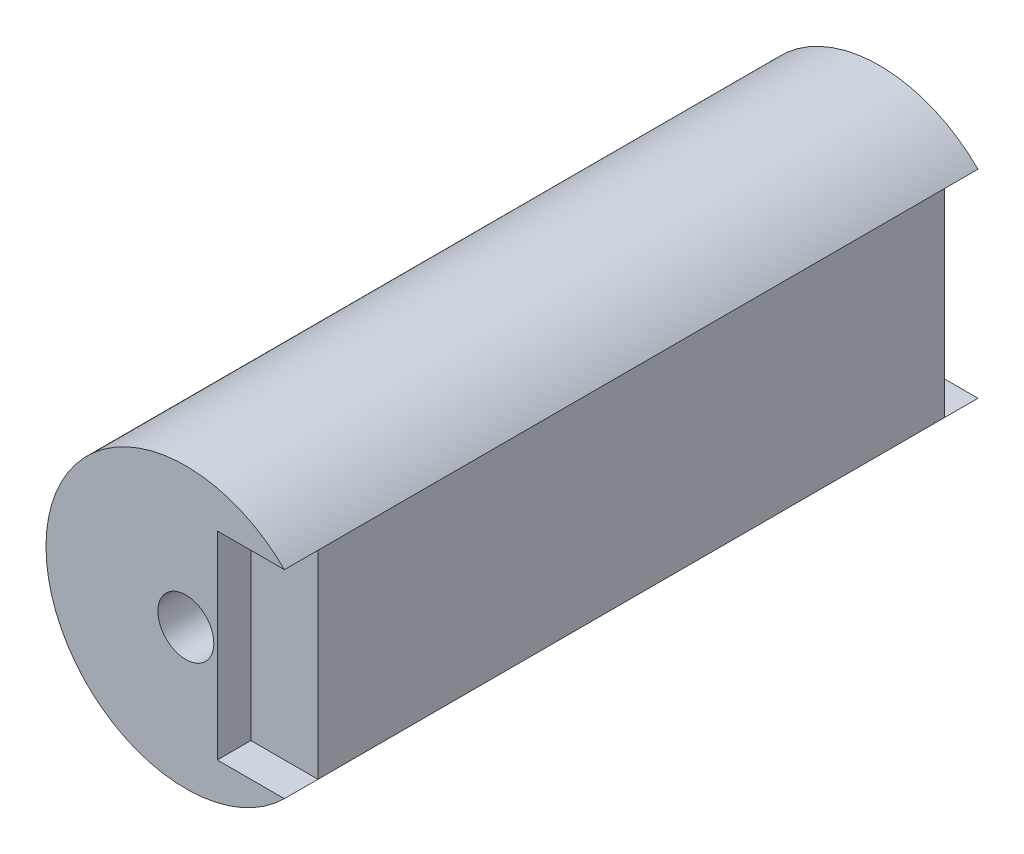
ISO-10303-21;
HEADER;
FILE_DESCRIPTION(('STEP AP214'),'2;1');
FILE_NAME('part.step','',(''),(''),'','','');
FILE_SCHEMA(('AUTOMOTIVE_DESIGN { 1 0 10303 214 1 1 1 1 }'));
ENDSEC;
DATA;
#1=APPLICATION_CONTEXT('core data for automotive mechanical design processes');
#2=APPLICATION_PROTOCOL_DEFINITION('international standard','automotive_design',2000,#1);
#3=PRODUCT_CONTEXT('',#1,'mechanical');
#4=PRODUCT('Part','Part','',(#3));
#5=PRODUCT_RELATED_PRODUCT_CATEGORY('part','',(#4));
#6=PRODUCT_DEFINITION_FORMATION('','',#4);
#7=PRODUCT_DEFINITION_CONTEXT('part definition',#1,'design');
#8=PRODUCT_DEFINITION('design','',#6,#7);
#9=PRODUCT_DEFINITION_SHAPE('','',#8);
#10=(LENGTH_UNIT() NAMED_UNIT(*) SI_UNIT(.MILLI.,.METRE.));
#11=(NAMED_UNIT(*) PLANE_ANGLE_UNIT() SI_UNIT($,.RADIAN.));
#12=(NAMED_UNIT(*) SI_UNIT($,.STERADIAN.) SOLID_ANGLE_UNIT());
#13=UNCERTAINTY_MEASURE_WITH_UNIT(LENGTH_MEASURE(1.E-05),#10,'distance_accuracy_value','');
#14=(GEOMETRIC_REPRESENTATION_CONTEXT(3) GLOBAL_UNCERTAINTY_ASSIGNED_CONTEXT((#13)) GLOBAL_UNIT_ASSIGNED_CONTEXT((#10,
#11,#12)) REPRESENTATION_CONTEXT('',''));
#15=CARTESIAN_POINT('',(0.,0.,0.));
#16=DIRECTION('',(0.,0.,1.));
#17=DIRECTION('',(1.,0.,0.));
#18=AXIS2_PLACEMENT_3D('',#15,#16,#17);
#19=CARTESIAN_POINT('',(8.81236982140303,8.86522070401099,0.));
#20=DIRECTION('',(-1.,0.,0.));
#21=DIRECTION('',(0.,0.,1.));
#22=AXIS2_PLACEMENT_3D('',#19,#20,#21);
#23=PLANE('',#22);
#24=DIRECTION('',(0.,0.,1.));
#25=VECTOR('',#24,1.);
#26=CARTESIAN_POINT('',(8.81236982140303,-8.86522070401099,11.2));
#27=LINE('',#26,#25);
#28=CARTESIAN_POINT('',(8.81236982140303,-8.86522070401099,70.2));
#29=VERTEX_POINT('',#28);
#30=CARTESIAN_POINT('',(8.81236982140303,-8.86522070401099,14.2));
#31=VERTEX_POINT('',#30);
#32=EDGE_CURVE('E150',#29,#31,#27,.F.);
#33=ORIENTED_EDGE('',*,*,#32,.T.);
#34=DIRECTION('',(0.,-1.,0.));
#35=VECTOR('',#34,1.);
#36=CARTESIAN_POINT('',(8.81236982140303,0.,14.2));
#37=LINE('',#36,#35);
#38=CARTESIAN_POINT('',(8.81236982140303,8.86522070401099,14.2));
#39=VERTEX_POINT('',#38);
#40=EDGE_CURVE('E180',#39,#31,#37,.T.);
#41=ORIENTED_EDGE('',*,*,#40,.F.);
#42=DIRECTION('',(0.,0.,1.));
#43=VECTOR('',#42,1.);
#44=CARTESIAN_POINT('',(8.81236982140303,8.86522070401099,11.2));
#45=LINE('',#44,#43);
#46=CARTESIAN_POINT('',(8.81236982140303,8.86522070401099,70.2));
#47=VERTEX_POINT('',#46);
#48=EDGE_CURVE('E63',#39,#47,#45,.T.);
#49=ORIENTED_EDGE('',*,*,#48,.T.);
#50=DIRECTION('',(0.,-1.,0.));
#51=VECTOR('',#50,1.);
#52=CARTESIAN_POINT('',(8.81236982140303,0.,70.2));
#53=LINE('',#52,#51);
#54=EDGE_CURVE('E144',#47,#29,#53,.T.);
#55=ORIENTED_EDGE('',*,*,#54,.T.);
#56=EDGE_LOOP('',(#33,#41,#49,#55));
#57=FACE_BOUND('',#56,.T.);
#58=ADVANCED_FACE('F40',(#57),#23,.F.);
#59=CARTESIAN_POINT('',(0.,0.,11.2));
#60=DIRECTION('',(0.,0.,1.));
#61=DIRECTION('',(1.,0.,0.));
#62=AXIS2_PLACEMENT_3D('',#59,#60,#61);
#63=CYLINDRICAL_SURFACE('',#62,12.5);
#64=CARTESIAN_POINT('',(0.,0.,11.2));
#65=DIRECTION('',(0.,0.,1.));
#66=DIRECTION('',(1.,0.,0.));
#67=AXIS2_PLACEMENT_3D('',#64,#65,#66);
#68=CIRCLE('',#67,12.5);
#69=CARTESIAN_POINT('',(8.81236982140303,8.86522070401099,11.2));
#70=VERTEX_POINT('',#69);
#71=CARTESIAN_POINT('',(8.81236982140303,-8.86522070401099,11.2));
#72=VERTEX_POINT('',#71);
#73=EDGE_CURVE('E11',#70,#72,#68,.T.);
#74=ORIENTED_EDGE('',*,*,#73,.T.);
#75=DIRECTION('',(0.,0.,-1.));
#76=VECTOR('',#75,1.);
#77=CARTESIAN_POINT('',(8.81236982140303,-8.86522070401099,-59.));
#78=LINE('',#77,#76);
#79=EDGE_CURVE('E113',#31,#72,#78,.T.);
#80=ORIENTED_EDGE('',*,*,#79,.F.);
#81=ORIENTED_EDGE('',*,*,#32,.F.);
#82=CARTESIAN_POINT('',(8.81236982140303,-8.86522070401099,73.2));
#83=VERTEX_POINT('',#82);
#84=EDGE_CURVE('E159',#83,#29,#27,.F.);
#85=ORIENTED_EDGE('',*,*,#84,.F.);
#86=CARTESIAN_POINT('',(0.,0.,73.2));
#87=DIRECTION('',(0.,0.,1.));
#88=DIRECTION('',(1.,0.,0.));
#89=AXIS2_PLACEMENT_3D('',#86,#87,#88);
#90=CIRCLE('',#89,12.5);
#91=CARTESIAN_POINT('',(8.81236982140303,8.86522070401099,73.2));
#92=VERTEX_POINT('',#91);
#93=EDGE_CURVE('E44',#92,#83,#90,.T.);
#94=ORIENTED_EDGE('',*,*,#93,.F.);
#95=DIRECTION('',(0.,0.,1.));
#96=VECTOR('',#95,1.);
#97=CARTESIAN_POINT('',(8.81236982140303,8.86522070401099,0.));
#98=LINE('',#97,#96);
#99=EDGE_CURVE('E135',#47,#92,#98,.T.);
#100=ORIENTED_EDGE('',*,*,#99,.F.);
#101=ORIENTED_EDGE('',*,*,#48,.F.);
#102=EDGE_CURVE('E162',#70,#39,#45,.T.);
#103=ORIENTED_EDGE('',*,*,#102,.F.);
#104=EDGE_LOOP('',(#74,#80,#81,#85,#94,#100,#101,#103));
#105=FACE_BOUND('',#104,.T.);
#106=ADVANCED_FACE('F42',(#105),#63,.T.);
#107=CARTESIAN_POINT('',(0.,0.,11.2));
#108=DIRECTION('',(0.,0.,1.));
#109=DIRECTION('',(1.,0.,0.));
#110=AXIS2_PLACEMENT_3D('',#107,#108,#109);
#111=PLANE('',#110);
#112=CARTESIAN_POINT('',(0.,0.,11.2));
#113=DIRECTION('',(0.,0.,1.));
#114=DIRECTION('',(1.,0.,0.));
#115=AXIS2_PLACEMENT_3D('',#112,#113,#114);
#116=CIRCLE('',#115,2.5);
#117=CARTESIAN_POINT('',(2.5,0.,11.2));
#118=VERTEX_POINT('',#117);
#119=EDGE_CURVE('E192',#118,#118,#116,.T.);
#120=ORIENTED_EDGE('',*,*,#119,.T.);
#121=EDGE_LOOP('',(#120));
#122=FACE_BOUND('',#121,.T.);
#123=DIRECTION('',(1.,0.,0.));
#124=VECTOR('',#123,1.);
#125=CARTESIAN_POINT('',(2.81236982140303,-8.86522070401099,11.2));
#126=LINE('',#125,#124);
#127=CARTESIAN_POINT('',(2.81236982140303,-8.86522070401099,11.2));
#128=VERTEX_POINT('',#127);
#129=EDGE_CURVE('E146',#128,#72,#126,.T.);
#130=ORIENTED_EDGE('',*,*,#129,.T.);
#131=ORIENTED_EDGE('',*,*,#73,.F.);
#132=DIRECTION('',(1.,0.,0.));
#133=VECTOR('',#132,1.);
#134=CARTESIAN_POINT('',(2.81236982140303,8.86522070401099,11.2));
#135=LINE('',#134,#133);
#136=CARTESIAN_POINT('',(2.81236982140303,8.86522070401099,11.2));
#137=VERTEX_POINT('',#136);
#138=EDGE_CURVE('E118',#137,#70,#135,.T.);
#139=ORIENTED_EDGE('',*,*,#138,.F.);
#140=DIRECTION('',(0.,-1.,0.));
#141=VECTOR('',#140,1.);
#142=CARTESIAN_POINT('',(2.81236982140303,0.,11.2));
#143=LINE('',#142,#141);
#144=EDGE_CURVE('E55',#137,#128,#143,.T.);
#145=ORIENTED_EDGE('',*,*,#144,.T.);
#146=EDGE_LOOP('',(#130,#131,#139,#145));
#147=FACE_BOUND('',#146,.T.);
#148=ADVANCED_FACE('F125',(#122,#147),#111,.F.);
#149=CARTESIAN_POINT('',(0.,0.,73.2));
#150=DIRECTION('',(0.,0.,1.));
#151=DIRECTION('',(1.,0.,0.));
#152=AXIS2_PLACEMENT_3D('',#149,#150,#151);
#153=PLANE('',#152);
#154=CARTESIAN_POINT('',(0.,0.,73.2));
#155=DIRECTION('',(0.,0.,1.));
#156=DIRECTION('',(1.,0.,0.));
#157=AXIS2_PLACEMENT_3D('',#154,#155,#156);
#158=CIRCLE('',#157,2.5);
#159=CARTESIAN_POINT('',(2.5,0.,73.2));
#160=VERTEX_POINT('',#159);
#161=EDGE_CURVE('E195',#160,#160,#158,.T.);
#162=ORIENTED_EDGE('',*,*,#161,.F.);
#163=EDGE_LOOP('',(#162));
#164=FACE_BOUND('',#163,.T.);
#165=ORIENTED_EDGE('',*,*,#93,.T.);
#166=DIRECTION('',(1.,0.,0.));
#167=VECTOR('',#166,1.);
#168=CARTESIAN_POINT('',(2.81236982140303,-8.86522070401099,73.2));
#169=LINE('',#168,#167);
#170=CARTESIAN_POINT('',(2.81236982140303,-8.86522070401099,73.2));
#171=VERTEX_POINT('',#170);
#172=EDGE_CURVE('E151',#171,#83,#169,.T.);
#173=ORIENTED_EDGE('',*,*,#172,.F.);
#174=DIRECTION('',(0.,-1.,0.));
#175=VECTOR('',#174,1.);
#176=CARTESIAN_POINT('',(2.81236982140303,0.,73.2));
#177=LINE('',#176,#175);
#178=CARTESIAN_POINT('',(2.81236982140303,8.86522070401099,73.2));
#179=VERTEX_POINT('',#178);
#180=EDGE_CURVE('E138',#179,#171,#177,.T.);
#181=ORIENTED_EDGE('',*,*,#180,.F.);
#182=DIRECTION('',(1.,0.,0.));
#183=VECTOR('',#182,1.);
#184=CARTESIAN_POINT('',(2.81236982140303,8.86522070401099,73.2));
#185=LINE('',#184,#183);
#186=EDGE_CURVE('E154',#179,#92,#185,.T.);
#187=ORIENTED_EDGE('',*,*,#186,.T.);
#188=EDGE_LOOP('',(#165,#173,#181,#187));
#189=FACE_BOUND('',#188,.T.);
#190=ADVANCED_FACE('F166',(#164,#189),#153,.T.);
#191=CARTESIAN_POINT('',(2.81236982140303,0.,70.2));
#192=DIRECTION('',(0.,0.,1.));
#193=DIRECTION('',(1.,0.,0.));
#194=AXIS2_PLACEMENT_3D('',#191,#192,#193);
#195=PLANE('',#194);
#196=ORIENTED_EDGE('',*,*,#54,.F.);
#197=DIRECTION('',(1.,0.,0.));
#198=VECTOR('',#197,1.);
#199=CARTESIAN_POINT('',(2.81236982140303,8.86522070401099,70.2));
#200=LINE('',#199,#198);
#201=CARTESIAN_POINT('',(2.81236982140303,8.86522070401099,70.2));
#202=VERTEX_POINT('',#201);
#203=EDGE_CURVE('E143',#202,#47,#200,.T.);
#204=ORIENTED_EDGE('',*,*,#203,.F.);
#205=DIRECTION('',(0.,-1.,0.));
#206=VECTOR('',#205,1.);
#207=CARTESIAN_POINT('',(2.81236982140303,0.,70.2));
#208=LINE('',#207,#206);
#209=CARTESIAN_POINT('',(2.81236982140303,-8.86522070401099,70.2));
#210=VERTEX_POINT('',#209);
#211=EDGE_CURVE('E132',#202,#210,#208,.T.);
#212=ORIENTED_EDGE('',*,*,#211,.T.);
#213=DIRECTION('',(1.,0.,0.));
#214=VECTOR('',#213,1.);
#215=CARTESIAN_POINT('',(2.81236982140303,-8.86522070401099,70.2));
#216=LINE('',#215,#214);
#217=EDGE_CURVE('E148',#210,#29,#216,.T.);
#218=ORIENTED_EDGE('',*,*,#217,.T.);
#219=EDGE_LOOP('',(#196,#204,#212,#218));
#220=FACE_BOUND('',#219,.T.);
#221=ADVANCED_FACE('F182',(#220),#195,.T.);
#222=CARTESIAN_POINT('',(2.81236982140303,-8.86522070401099,0.));
#223=DIRECTION('',(0.,-1.,0.));
#224=DIRECTION('',(0.,0.,-1.));
#225=AXIS2_PLACEMENT_3D('',#222,#223,#224);
#226=PLANE('',#225);
#227=ORIENTED_EDGE('',*,*,#84,.T.);
#228=ORIENTED_EDGE('',*,*,#217,.F.);
#229=DIRECTION('',(0.,0.,-1.));
#230=VECTOR('',#229,1.);
#231=CARTESIAN_POINT('',(2.81236982140303,-8.86522070401099,0.));
#232=LINE('',#231,#230);
#233=EDGE_CURVE('E140',#171,#210,#232,.T.);
#234=ORIENTED_EDGE('',*,*,#233,.F.);
#235=ORIENTED_EDGE('',*,*,#172,.T.);
#236=EDGE_LOOP('',(#227,#228,#234,#235));
#237=FACE_BOUND('',#236,.T.);
#238=ADVANCED_FACE('F173',(#237),#226,.F.);
#239=CARTESIAN_POINT('',(2.81236982140303,8.86522070401099,0.));
#240=DIRECTION('',(0.,1.,0.));
#241=DIRECTION('',(0.,0.,1.));
#242=AXIS2_PLACEMENT_3D('',#239,#240,#241);
#243=PLANE('',#242);
#244=ORIENTED_EDGE('',*,*,#99,.T.);
#245=ORIENTED_EDGE('',*,*,#186,.F.);
#246=DIRECTION('',(0.,0.,1.));
#247=VECTOR('',#246,1.);
#248=CARTESIAN_POINT('',(2.81236982140303,8.86522070401099,0.));
#249=LINE('',#248,#247);
#250=EDGE_CURVE('E134',#202,#179,#249,.T.);
#251=ORIENTED_EDGE('',*,*,#250,.F.);
#252=ORIENTED_EDGE('',*,*,#203,.T.);
#253=EDGE_LOOP('',(#244,#245,#251,#252));
#254=FACE_BOUND('',#253,.T.);
#255=ADVANCED_FACE('F186',(#254),#243,.F.);
#256=CARTESIAN_POINT('',(2.81236982140303,0.,0.));
#257=DIRECTION('',(1.,0.,0.));
#258=DIRECTION('',(0.,0.,-1.));
#259=AXIS2_PLACEMENT_3D('',#256,#257,#258);
#260=PLANE('',#259);
#261=ORIENTED_EDGE('',*,*,#211,.F.);
#262=ORIENTED_EDGE('',*,*,#250,.T.);
#263=ORIENTED_EDGE('',*,*,#180,.T.);
#264=ORIENTED_EDGE('',*,*,#233,.T.);
#265=EDGE_LOOP('',(#261,#262,#263,#264));
#266=FACE_BOUND('',#265,.T.);
#267=ADVANCED_FACE('F224',(#266),#260,.T.);
#268=CARTESIAN_POINT('',(2.81236982140303,-8.86522070401099,-59.));
#269=DIRECTION('',(0.,-1.,0.));
#270=DIRECTION('',(0.,0.,-1.));
#271=AXIS2_PLACEMENT_3D('',#268,#269,#270);
#272=PLANE('',#271);
#273=ORIENTED_EDGE('',*,*,#79,.T.);
#274=ORIENTED_EDGE('',*,*,#129,.F.);
#275=DIRECTION('',(0.,0.,-1.));
#276=VECTOR('',#275,1.);
#277=CARTESIAN_POINT('',(2.81236982140303,-8.86522070401099,-59.));
#278=LINE('',#277,#276);
#279=CARTESIAN_POINT('',(2.81236982140303,-8.86522070401099,14.2));
#280=VERTEX_POINT('',#279);
#281=EDGE_CURVE('E111',#280,#128,#278,.T.);
#282=ORIENTED_EDGE('',*,*,#281,.F.);
#283=DIRECTION('',(1.,0.,0.));
#284=VECTOR('',#283,1.);
#285=CARTESIAN_POINT('',(2.81236982140303,-8.86522070401099,14.2));
#286=LINE('',#285,#284);
#287=EDGE_CURVE('E127',#280,#31,#286,.T.);
#288=ORIENTED_EDGE('',*,*,#287,.T.);
#289=EDGE_LOOP('',(#273,#274,#282,#288));
#290=FACE_BOUND('',#289,.T.);
#291=ADVANCED_FACE('F188',(#290),#272,.F.);
#292=CARTESIAN_POINT('',(2.81236982140303,0.,14.2));
#293=DIRECTION('',(0.,0.,1.));
#294=DIRECTION('',(1.,0.,0.));
#295=AXIS2_PLACEMENT_3D('',#292,#293,#294);
#296=PLANE('',#295);
#297=ORIENTED_EDGE('',*,*,#40,.T.);
#298=ORIENTED_EDGE('',*,*,#287,.F.);
#299=DIRECTION('',(0.,-1.,0.));
#300=VECTOR('',#299,1.);
#301=CARTESIAN_POINT('',(2.81236982140303,0.,14.2));
#302=LINE('',#301,#300);
#303=CARTESIAN_POINT('',(2.81236982140303,8.86522070401099,14.2));
#304=VERTEX_POINT('',#303);
#305=EDGE_CURVE('E122',#304,#280,#302,.T.);
#306=ORIENTED_EDGE('',*,*,#305,.F.);
#307=DIRECTION('',(1.,0.,0.));
#308=VECTOR('',#307,1.);
#309=CARTESIAN_POINT('',(2.81236982140303,8.86522070401099,14.2));
#310=LINE('',#309,#308);
#311=EDGE_CURVE('E120',#304,#39,#310,.T.);
#312=ORIENTED_EDGE('',*,*,#311,.T.);
#313=EDGE_LOOP('',(#297,#298,#306,#312));
#314=FACE_BOUND('',#313,.T.);
#315=ADVANCED_FACE('F232',(#314),#296,.F.);
#316=CARTESIAN_POINT('',(2.81236982140303,8.86522070401099,-59.));
#317=DIRECTION('',(0.,1.,0.));
#318=DIRECTION('',(0.,0.,1.));
#319=AXIS2_PLACEMENT_3D('',#316,#317,#318);
#320=PLANE('',#319);
#321=ORIENTED_EDGE('',*,*,#102,.T.);
#322=ORIENTED_EDGE('',*,*,#311,.F.);
#323=DIRECTION('',(0.,0.,1.));
#324=VECTOR('',#323,1.);
#325=CARTESIAN_POINT('',(2.81236982140303,8.86522070401099,-59.));
#326=LINE('',#325,#324);
#327=EDGE_CURVE('E109',#137,#304,#326,.T.);
#328=ORIENTED_EDGE('',*,*,#327,.F.);
#329=ORIENTED_EDGE('',*,*,#138,.T.);
#330=EDGE_LOOP('',(#321,#322,#328,#329));
#331=FACE_BOUND('',#330,.T.);
#332=ADVANCED_FACE('F117',(#331),#320,.F.);
#333=CARTESIAN_POINT('',(2.81236982140303,0.,-59.));
#334=DIRECTION('',(1.,0.,0.));
#335=DIRECTION('',(0.,0.,-1.));
#336=AXIS2_PLACEMENT_3D('',#333,#334,#335);
#337=PLANE('',#336);
#338=ORIENTED_EDGE('',*,*,#144,.F.);
#339=ORIENTED_EDGE('',*,*,#327,.T.);
#340=ORIENTED_EDGE('',*,*,#305,.T.);
#341=ORIENTED_EDGE('',*,*,#281,.T.);
#342=EDGE_LOOP('',(#338,#339,#340,#341));
#343=FACE_BOUND('',#342,.T.);
#344=ADVANCED_FACE('F107',(#343),#337,.T.);
#345=CARTESIAN_POINT('',(0.,0.,11.2));
#346=DIRECTION('',(0.,0.,1.));
#347=DIRECTION('',(1.,0.,0.));
#348=AXIS2_PLACEMENT_3D('',#345,#346,#347);
#349=CYLINDRICAL_SURFACE('',#348,2.5);
#350=ORIENTED_EDGE('',*,*,#119,.F.);
#351=EDGE_LOOP('',(#350));
#352=FACE_BOUND('',#351,.T.);
#353=ORIENTED_EDGE('',*,*,#161,.T.);
#354=EDGE_LOOP('',(#353));
#355=FACE_BOUND('',#354,.T.);
#356=ADVANCED_FACE('F202',(#352,#355),#349,.F.);
#357=CLOSED_SHELL('',(#58,#106,#148,#190,#221,#238,#255,#267,#291,#315,#332,#344,#356));
#358=MANIFOLD_SOLID_BREP('B2',#357);
#359=ADVANCED_BREP_SHAPE_REPRESENTATION('',(#18,#358),#14);
#360=SHAPE_DEFINITION_REPRESENTATION(#9,#359);
ENDSEC;
END-ISO-10303-21;
